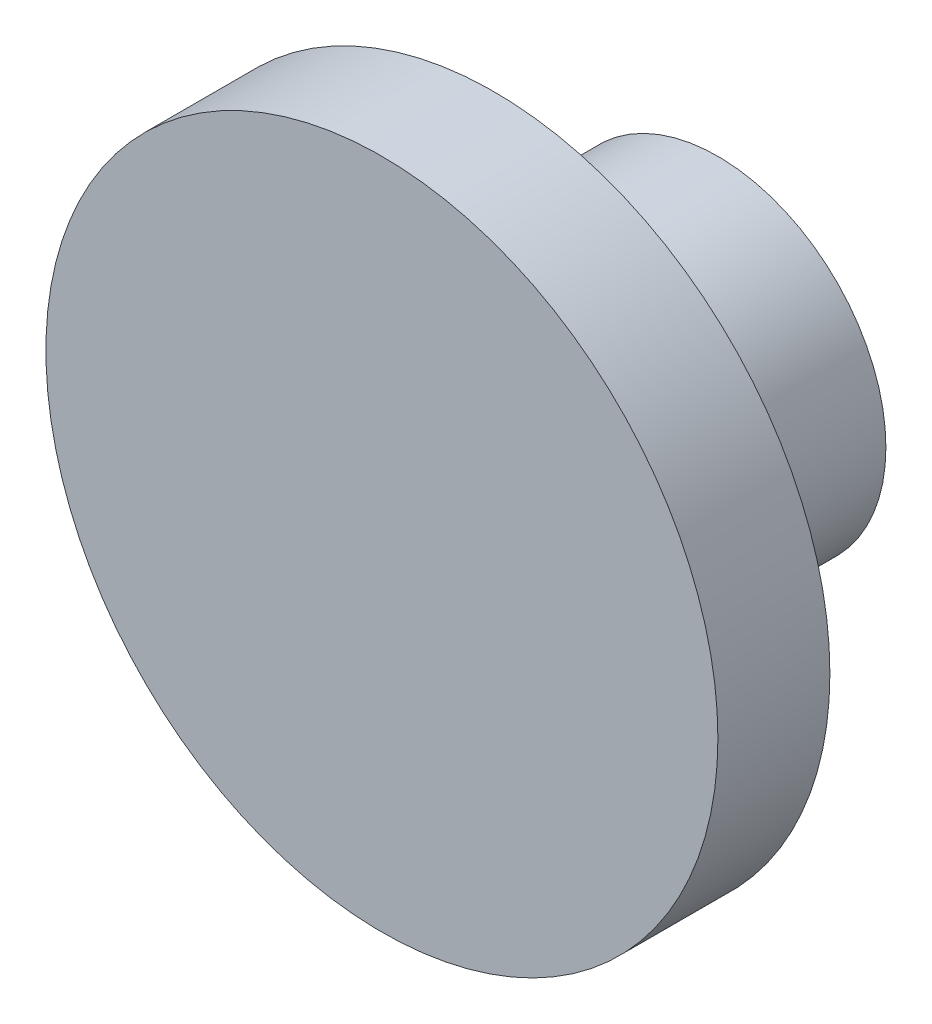
ISO-10303-21;
HEADER;
FILE_DESCRIPTION(('STEP AP214'),'2;1');
FILE_NAME('part.step','',(''),(''),'','','');
FILE_SCHEMA(('AUTOMOTIVE_DESIGN { 1 0 10303 214 1 1 1 1 }'));
ENDSEC;
DATA;
#1=APPLICATION_CONTEXT('core data for automotive mechanical design processes');
#2=APPLICATION_PROTOCOL_DEFINITION('international standard','automotive_design',2000,#1);
#3=PRODUCT_CONTEXT('',#1,'mechanical');
#4=PRODUCT('Part','Part','',(#3));
#5=PRODUCT_RELATED_PRODUCT_CATEGORY('part','',(#4));
#6=PRODUCT_DEFINITION_FORMATION('','',#4);
#7=PRODUCT_DEFINITION_CONTEXT('part definition',#1,'design');
#8=PRODUCT_DEFINITION('design','',#6,#7);
#9=PRODUCT_DEFINITION_SHAPE('','',#8);
#10=(LENGTH_UNIT() NAMED_UNIT(*) SI_UNIT(.MILLI.,.METRE.));
#11=(NAMED_UNIT(*) PLANE_ANGLE_UNIT() SI_UNIT($,.RADIAN.));
#12=(NAMED_UNIT(*) SI_UNIT($,.STERADIAN.) SOLID_ANGLE_UNIT());
#13=UNCERTAINTY_MEASURE_WITH_UNIT(LENGTH_MEASURE(1.E-05),#10,'distance_accuracy_value','');
#14=(GEOMETRIC_REPRESENTATION_CONTEXT(3) GLOBAL_UNCERTAINTY_ASSIGNED_CONTEXT((#13)) GLOBAL_UNIT_ASSIGNED_CONTEXT((#10,
#11,#12)) REPRESENTATION_CONTEXT('',''));
#15=CARTESIAN_POINT('',(0.,0.,0.));
#16=DIRECTION('',(0.,0.,1.));
#17=DIRECTION('',(1.,0.,0.));
#18=AXIS2_PLACEMENT_3D('',#15,#16,#17);
#19=CARTESIAN_POINT('',(0.,0.,10.));
#20=DIRECTION('',(0.,0.,-1.));
#21=DIRECTION('',(-1.,0.,0.));
#22=AXIS2_PLACEMENT_3D('',#19,#20,#21);
#23=CYLINDRICAL_SURFACE('',#22,7.5);
#24=CARTESIAN_POINT('',(0.,0.,10.));
#25=DIRECTION('',(0.,0.,1.));
#26=DIRECTION('',(1.,0.,0.));
#27=AXIS2_PLACEMENT_3D('',#24,#25,#26);
#28=CIRCLE('',#27,7.5);
#29=CARTESIAN_POINT('',(7.5,0.,10.));
#30=VERTEX_POINT('',#29);
#31=EDGE_CURVE('E10',#30,#30,#28,.T.);
#32=ORIENTED_EDGE('',*,*,#31,.F.);
#33=EDGE_LOOP('',(#32));
#34=FACE_BOUND('',#33,.T.);
#35=CARTESIAN_POINT('',(0.,0.,0.));
#36=DIRECTION('',(0.,0.,1.));
#37=DIRECTION('',(1.,0.,0.));
#38=AXIS2_PLACEMENT_3D('',#35,#36,#37);
#39=CIRCLE('',#38,7.5);
#40=CARTESIAN_POINT('',(7.5,0.,0.));
#41=VERTEX_POINT('',#40);
#42=EDGE_CURVE('E39',#41,#41,#39,.T.);
#43=ORIENTED_EDGE('',*,*,#42,.T.);
#44=EDGE_LOOP('',(#43));
#45=FACE_BOUND('',#44,.T.);
#46=ADVANCED_FACE('F36',(#34,#45),#23,.T.);
#47=CARTESIAN_POINT('',(0.,0.,0.));
#48=DIRECTION('',(0.,0.,1.));
#49=DIRECTION('',(1.,0.,0.));
#50=AXIS2_PLACEMENT_3D('',#47,#48,#49);
#51=PLANE('',#50);
#52=CARTESIAN_POINT('',(0.,0.,0.));
#53=DIRECTION('',(0.,0.,-1.));
#54=DIRECTION('',(-1.,0.,0.));
#55=AXIS2_PLACEMENT_3D('',#52,#53,#54);
#56=CIRCLE('',#55,2.5);
#57=CARTESIAN_POINT('',(-2.5,0.,0.));
#58=VERTEX_POINT('',#57);
#59=EDGE_CURVE('E54',#58,#58,#56,.T.);
#60=ORIENTED_EDGE('',*,*,#59,.F.);
#61=EDGE_LOOP('',(#60));
#62=FACE_BOUND('',#61,.T.);
#63=ORIENTED_EDGE('',*,*,#42,.F.);
#64=EDGE_LOOP('',(#63));
#65=FACE_BOUND('',#64,.T.);
#66=ADVANCED_FACE('F69',(#62,#65),#51,.F.);
#67=CARTESIAN_POINT('',(0.,0.,15.));
#68=DIRECTION('',(0.,0.,-1.));
#69=DIRECTION('',(-1.,0.,0.));
#70=AXIS2_PLACEMENT_3D('',#67,#68,#69);
#71=CYLINDRICAL_SURFACE('',#70,15.);
#72=CARTESIAN_POINT('',(0.,0.,15.));
#73=DIRECTION('',(0.,0.,1.));
#74=DIRECTION('',(1.,0.,0.));
#75=AXIS2_PLACEMENT_3D('',#72,#73,#74);
#76=CIRCLE('',#75,15.);
#77=CARTESIAN_POINT('',(15.,0.,15.));
#78=VERTEX_POINT('',#77);
#79=EDGE_CURVE('E46',#78,#78,#76,.T.);
#80=ORIENTED_EDGE('',*,*,#79,.F.);
#81=EDGE_LOOP('',(#80));
#82=FACE_BOUND('',#81,.T.);
#83=CARTESIAN_POINT('',(0.,0.,10.));
#84=DIRECTION('',(0.,0.,1.));
#85=DIRECTION('',(1.,0.,0.));
#86=AXIS2_PLACEMENT_3D('',#83,#84,#85);
#87=CIRCLE('',#86,15.);
#88=CARTESIAN_POINT('',(15.,0.,10.));
#89=VERTEX_POINT('',#88);
#90=EDGE_CURVE('E48',#89,#89,#87,.T.);
#91=ORIENTED_EDGE('',*,*,#90,.T.);
#92=EDGE_LOOP('',(#91));
#93=FACE_BOUND('',#92,.T.);
#94=ADVANCED_FACE('F72',(#82,#93),#71,.T.);
#95=CARTESIAN_POINT('',(0.,0.,15.));
#96=DIRECTION('',(0.,0.,1.));
#97=DIRECTION('',(1.,0.,0.));
#98=AXIS2_PLACEMENT_3D('',#95,#96,#97);
#99=PLANE('',#98);
#100=ORIENTED_EDGE('',*,*,#79,.T.);
#101=EDGE_LOOP('',(#100));
#102=FACE_BOUND('',#101,.T.);
#103=ADVANCED_FACE('F90',(#102),#99,.T.);
#104=CARTESIAN_POINT('',(0.,0.,10.));
#105=DIRECTION('',(0.,0.,1.));
#106=DIRECTION('',(1.,0.,0.));
#107=AXIS2_PLACEMENT_3D('',#104,#105,#106);
#108=PLANE('',#107);
#109=ORIENTED_EDGE('',*,*,#31,.T.);
#110=EDGE_LOOP('',(#109));
#111=FACE_BOUND('',#110,.T.);
#112=ORIENTED_EDGE('',*,*,#90,.F.);
#113=EDGE_LOOP('',(#112));
#114=FACE_BOUND('',#113,.T.);
#115=ADVANCED_FACE('F65',(#111,#114),#108,.F.);
#116=CARTESIAN_POINT('',(0.,0.,5.));
#117=DIRECTION('',(0.,0.,-1.));
#118=DIRECTION('',(-1.,0.,0.));
#119=AXIS2_PLACEMENT_3D('',#116,#117,#118);
#120=CYLINDRICAL_SURFACE('',#119,2.5);
#121=CARTESIAN_POINT('',(0.,0.,5.));
#122=DIRECTION('',(0.,0.,-1.));
#123=DIRECTION('',(-1.,0.,0.));
#124=AXIS2_PLACEMENT_3D('',#121,#122,#123);
#125=CIRCLE('',#124,2.5);
#126=CARTESIAN_POINT('',(-2.5,0.,5.));
#127=VERTEX_POINT('',#126);
#128=EDGE_CURVE('E51',#127,#127,#125,.T.);
#129=ORIENTED_EDGE('',*,*,#128,.F.);
#130=EDGE_LOOP('',(#129));
#131=FACE_BOUND('',#130,.T.);
#132=ORIENTED_EDGE('',*,*,#59,.T.);
#133=EDGE_LOOP('',(#132));
#134=FACE_BOUND('',#133,.T.);
#135=ADVANCED_FACE('F62',(#131,#134),#120,.F.);
#136=CARTESIAN_POINT('',(0.,0.,5.));
#137=DIRECTION('',(0.,0.,-1.));
#138=DIRECTION('',(-1.,0.,0.));
#139=AXIS2_PLACEMENT_3D('',#136,#137,#138);
#140=PLANE('',#139);
#141=ORIENTED_EDGE('',*,*,#128,.T.);
#142=EDGE_LOOP('',(#141));
#143=FACE_BOUND('',#142,.T.);
#144=ADVANCED_FACE('F60',(#143),#140,.T.);
#145=CLOSED_SHELL('',(#46,#66,#94,#103,#115,#135,#144));
#146=MANIFOLD_SOLID_BREP('B2',#145);
#147=ADVANCED_BREP_SHAPE_REPRESENTATION('',(#18,#146),#14);
#148=SHAPE_DEFINITION_REPRESENTATION(#9,#147);
ENDSEC;
END-ISO-10303-21;
